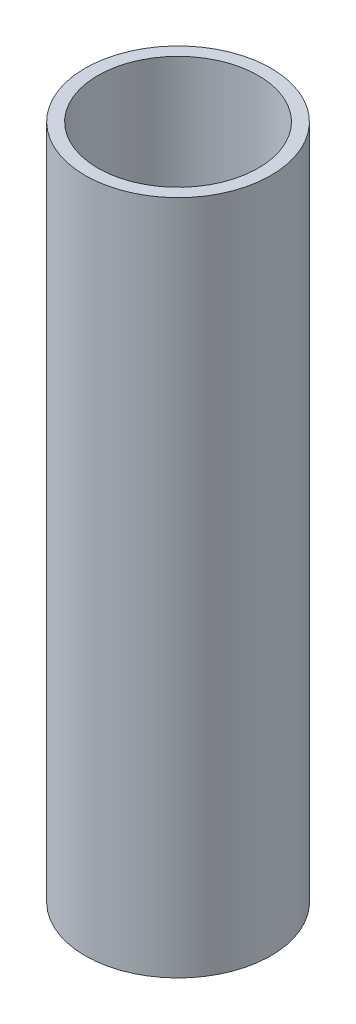
ISO-10303-21;
HEADER;
FILE_DESCRIPTION(('STEP AP214'),'2;1');
FILE_NAME('part.step','',(''),(''),'','','');
FILE_SCHEMA(('AUTOMOTIVE_DESIGN { 1 0 10303 214 1 1 1 1 }'));
ENDSEC;
DATA;
#1=APPLICATION_CONTEXT('core data for automotive mechanical design processes');
#2=APPLICATION_PROTOCOL_DEFINITION('international standard','automotive_design',2000,#1);
#3=PRODUCT_CONTEXT('',#1,'mechanical');
#4=PRODUCT('Part','Part','',(#3));
#5=PRODUCT_RELATED_PRODUCT_CATEGORY('part','',(#4));
#6=PRODUCT_DEFINITION_FORMATION('','',#4);
#7=PRODUCT_DEFINITION_CONTEXT('part definition',#1,'design');
#8=PRODUCT_DEFINITION('design','',#6,#7);
#9=PRODUCT_DEFINITION_SHAPE('','',#8);
#10=(LENGTH_UNIT() NAMED_UNIT(*) SI_UNIT(.MILLI.,.METRE.));
#11=(NAMED_UNIT(*) PLANE_ANGLE_UNIT() SI_UNIT($,.RADIAN.));
#12=(NAMED_UNIT(*) SI_UNIT($,.STERADIAN.) SOLID_ANGLE_UNIT());
#13=UNCERTAINTY_MEASURE_WITH_UNIT(LENGTH_MEASURE(1.E-05),#10,'distance_accuracy_value','');
#14=(GEOMETRIC_REPRESENTATION_CONTEXT(3) GLOBAL_UNCERTAINTY_ASSIGNED_CONTEXT((#13)) GLOBAL_UNIT_ASSIGNED_CONTEXT((#10,
#11,#12)) REPRESENTATION_CONTEXT('',''));
#15=CARTESIAN_POINT('',(0.,0.,0.));
#16=DIRECTION('',(0.,0.,1.));
#17=DIRECTION('',(1.,0.,0.));
#18=AXIS2_PLACEMENT_3D('',#15,#16,#17);
#19=CARTESIAN_POINT('',(0.,80.,0.));
#20=DIRECTION('',(0.,1.,0.));
#21=DIRECTION('',(0.,0.,1.));
#22=AXIS2_PLACEMENT_3D('',#19,#20,#21);
#23=PLANE('',#22);
#24=CARTESIAN_POINT('',(0.,80.,0.));
#25=DIRECTION('',(0.,1.,0.));
#26=DIRECTION('',(0.,0.,1.));
#27=AXIS2_PLACEMENT_3D('',#24,#25,#26);
#28=CIRCLE('',#27,11.);
#29=CARTESIAN_POINT('',(0.,80.,11.));
#30=VERTEX_POINT('',#29);
#31=EDGE_CURVE('E10',#30,#30,#28,.T.);
#32=ORIENTED_EDGE('',*,*,#31,.T.);
#33=EDGE_LOOP('',(#32));
#34=FACE_BOUND('',#33,.T.);
#35=CARTESIAN_POINT('',(0.,80.,0.));
#36=DIRECTION('',(0.,1.,0.));
#37=DIRECTION('',(0.,0.,1.));
#38=AXIS2_PLACEMENT_3D('',#35,#36,#37);
#39=CIRCLE('',#38,9.5);
#40=CARTESIAN_POINT('',(0.,80.,9.5));
#41=VERTEX_POINT('',#40);
#42=EDGE_CURVE('E41',#41,#41,#39,.T.);
#43=ORIENTED_EDGE('',*,*,#42,.F.);
#44=EDGE_LOOP('',(#43));
#45=FACE_BOUND('',#44,.T.);
#46=ADVANCED_FACE('F30',(#34,#45),#23,.T.);
#47=CARTESIAN_POINT('',(0.,0.,0.));
#48=DIRECTION('',(0.,1.,0.));
#49=DIRECTION('',(0.,0.,1.));
#50=AXIS2_PLACEMENT_3D('',#47,#48,#49);
#51=PLANE('',#50);
#52=CARTESIAN_POINT('',(0.,0.,0.));
#53=DIRECTION('',(0.,1.,0.));
#54=DIRECTION('',(0.,0.,1.));
#55=AXIS2_PLACEMENT_3D('',#52,#53,#54);
#56=CIRCLE('',#55,11.);
#57=CARTESIAN_POINT('',(0.,0.,11.));
#58=VERTEX_POINT('',#57);
#59=EDGE_CURVE('E34',#58,#58,#56,.T.);
#60=ORIENTED_EDGE('',*,*,#59,.F.);
#61=EDGE_LOOP('',(#60));
#62=FACE_BOUND('',#61,.T.);
#63=CARTESIAN_POINT('',(0.,0.,0.));
#64=DIRECTION('',(0.,1.,0.));
#65=DIRECTION('',(0.,0.,1.));
#66=AXIS2_PLACEMENT_3D('',#63,#64,#65);
#67=CIRCLE('',#66,9.5);
#68=CARTESIAN_POINT('',(0.,0.,9.5));
#69=VERTEX_POINT('',#68);
#70=EDGE_CURVE('E43',#69,#69,#67,.T.);
#71=ORIENTED_EDGE('',*,*,#70,.T.);
#72=EDGE_LOOP('',(#71));
#73=FACE_BOUND('',#72,.T.);
#74=ADVANCED_FACE('F53',(#62,#73),#51,.F.);
#75=CARTESIAN_POINT('',(0.,80.,0.));
#76=DIRECTION('',(0.,-1.,0.));
#77=DIRECTION('',(0.,0.,-1.));
#78=AXIS2_PLACEMENT_3D('',#75,#76,#77);
#79=CYLINDRICAL_SURFACE('',#78,11.);
#80=ORIENTED_EDGE('',*,*,#31,.F.);
#81=EDGE_LOOP('',(#80));
#82=FACE_BOUND('',#81,.T.);
#83=ORIENTED_EDGE('',*,*,#59,.T.);
#84=EDGE_LOOP('',(#83));
#85=FACE_BOUND('',#84,.T.);
#86=ADVANCED_FACE('F32',(#82,#85),#79,.T.);
#87=CARTESIAN_POINT('',(0.,80.,0.));
#88=DIRECTION('',(0.,-1.,0.));
#89=DIRECTION('',(0.,0.,-1.));
#90=AXIS2_PLACEMENT_3D('',#87,#88,#89);
#91=CYLINDRICAL_SURFACE('',#90,9.5);
#92=ORIENTED_EDGE('',*,*,#42,.T.);
#93=EDGE_LOOP('',(#92));
#94=FACE_BOUND('',#93,.T.);
#95=ORIENTED_EDGE('',*,*,#70,.F.);
#96=EDGE_LOOP('',(#95));
#97=FACE_BOUND('',#96,.T.);
#98=ADVANCED_FACE('F49',(#94,#97),#91,.F.);
#99=CLOSED_SHELL('',(#46,#74,#86,#98));
#100=MANIFOLD_SOLID_BREP('B2',#99);
#101=ADVANCED_BREP_SHAPE_REPRESENTATION('',(#18,#100),#14);
#102=SHAPE_DEFINITION_REPRESENTATION(#9,#101);
ENDSEC;
END-ISO-10303-21;
